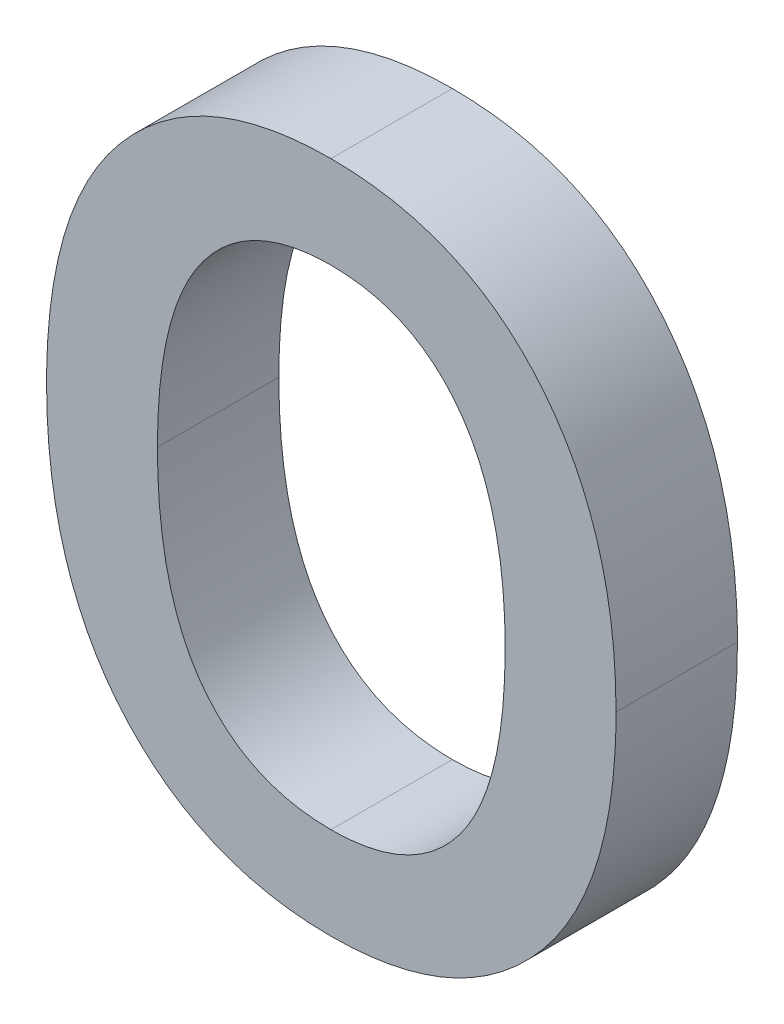
ISO-10303-21;
HEADER;
FILE_DESCRIPTION(('STEP AP214'),'2;1');
FILE_NAME('part.step','',(''),(''),'','','');
FILE_SCHEMA(('AUTOMOTIVE_DESIGN { 1 0 10303 214 1 1 1 1 }'));
ENDSEC;
DATA;
#1=APPLICATION_CONTEXT('core data for automotive mechanical design processes');
#2=APPLICATION_PROTOCOL_DEFINITION('international standard','automotive_design',2000,#1);
#3=PRODUCT_CONTEXT('',#1,'mechanical');
#4=PRODUCT('Part','Part','',(#3));
#5=PRODUCT_RELATED_PRODUCT_CATEGORY('part','',(#4));
#6=PRODUCT_DEFINITION_FORMATION('','',#4);
#7=PRODUCT_DEFINITION_CONTEXT('part definition',#1,'design');
#8=PRODUCT_DEFINITION('design','',#6,#7);
#9=PRODUCT_DEFINITION_SHAPE('','',#8);
#10=(LENGTH_UNIT() NAMED_UNIT(*) SI_UNIT(.MILLI.,.METRE.));
#11=(NAMED_UNIT(*) PLANE_ANGLE_UNIT() SI_UNIT($,.RADIAN.));
#12=(NAMED_UNIT(*) SI_UNIT($,.STERADIAN.) SOLID_ANGLE_UNIT());
#13=UNCERTAINTY_MEASURE_WITH_UNIT(LENGTH_MEASURE(1.E-05),#10,'distance_accuracy_value','');
#14=(GEOMETRIC_REPRESENTATION_CONTEXT(3) GLOBAL_UNCERTAINTY_ASSIGNED_CONTEXT((#13)) GLOBAL_UNIT_ASSIGNED_CONTEXT((#10,
#11,#12)) REPRESENTATION_CONTEXT('',''));
#15=CARTESIAN_POINT('',(0.,0.,0.));
#16=DIRECTION('',(0.,0.,1.));
#17=DIRECTION('',(1.,0.,0.));
#18=AXIS2_PLACEMENT_3D('',#15,#16,#17);
#19=CARTESIAN_POINT('',(0.445025567539005,1.223113950153,0.));
#20=CARTESIAN_POINT('',(0.445025567539005,1.223113950153,0.1));
#21=CARTESIAN_POINT('',(0.376969810098342,1.223113950153,0.));
#22=CARTESIAN_POINT('',(0.376969810098342,1.223113950153,0.1));
#23=CARTESIAN_POINT('',(0.302108476913613,1.122731707928,0.));
#24=CARTESIAN_POINT('',(0.302108476913613,1.122731707928,0.1));
#25=CARTESIAN_POINT('',(0.302108476913613,1.021782334391,0.));
#26=CARTESIAN_POINT('',(0.302108476913613,1.021782334391,0.1));
#27=B_SPLINE_SURFACE_WITH_KNOTS('',2,1,((#19,#20),(#21,#22),(#23,#24),(#25,#26)),.UNSPECIFIED.,
.F.,.F.,.F.,(3,1,3),(2,2),(0.,1.,2.),(0.,0.01),.UNSPECIFIED.);
#28=CARTESIAN_POINT('',(0.445025567539005,1.223113950153,0.));
#29=CARTESIAN_POINT('',(0.376969810098342,1.223113950153,0.));
#30=CARTESIAN_POINT('',(0.302108476913613,1.122731707928,0.));
#31=CARTESIAN_POINT('',(0.302108476913613,1.021782334391,0.));
#32=B_SPLINE_CURVE_WITH_KNOTS('',2,(#28,#29,#30,#31),.UNSPECIFIED.,.F.,.F.,(3,1,3),(0.,1.,2.),.UNSPECIFIED.);
#33=CARTESIAN_POINT('',(0.445025567539005,1.223113950153,0.));
#34=VERTEX_POINT('',#33);
#35=CARTESIAN_POINT('',(0.302108476913613,1.021782334391,0.));
#36=VERTEX_POINT('',#35);
#37=EDGE_CURVE('E11',#34,#36,#32,.T.);
#38=DIRECTION('',(0.,0.,1.));
#39=VECTOR('',#38,1.);
#40=CARTESIAN_POINT('',(0.445025567539005,1.223113950153,0.));
#41=LINE('',#40,#39);
#42=CARTESIAN_POINT('',(0.445025567539005,1.223113950153,0.1));
#43=VERTEX_POINT('',#42);
#44=EDGE_CURVE('E28',#34,#43,#41,.T.);
#45=CARTESIAN_POINT('',(0.302108476913613,1.021782334391,0.1));
#46=CARTESIAN_POINT('',(0.302108476913613,1.122731707928,0.1));
#47=CARTESIAN_POINT('',(0.376969810098342,1.223113950153,0.1));
#48=CARTESIAN_POINT('',(0.445025567539005,1.223113950153,0.1));
#49=B_SPLINE_CURVE_WITH_KNOTS('',2,(#45,#46,#47,#48),.UNSPECIFIED.,.F.,.F.,(3,1,3),(-2.,-1.,0.),.UNSPECIFIED.);
#50=CARTESIAN_POINT('',(0.302108476913613,1.021782334391,0.1));
#51=VERTEX_POINT('',#50);
#52=EDGE_CURVE('E221',#51,#43,#49,.T.);
#53=DIRECTION('',(0.,0.,1.));
#54=VECTOR('',#53,1.);
#55=CARTESIAN_POINT('',(0.302108476913613,1.021782334391,0.));
#56=LINE('',#55,#54);
#57=EDGE_CURVE('E41',#36,#51,#56,.T.);
#58=ORIENTED_EDGE('',*,*,#37,.F.);
#59=ORIENTED_EDGE('',*,*,#44,.T.);
#60=ORIENTED_EDGE('',*,*,#52,.F.);
#61=ORIENTED_EDGE('',*,*,#57,.F.);
#62=EDGE_LOOP('',(#58,#59,#60,#61));
#63=FACE_BOUND('',#62,.T.);
#64=ADVANCED_FACE('F17',(#63),#27,.F.);
#65=CARTESIAN_POINT('',(0.588509789476403,1.021782334391,0.));
#66=CARTESIAN_POINT('',(0.588509789476403,1.021782334391,0.1));
#67=CARTESIAN_POINT('',(0.588509789476403,1.121030313992,0.));
#68=CARTESIAN_POINT('',(0.588509789476403,1.121030313992,0.1));
#69=CARTESIAN_POINT('',(0.513648456291673,1.223113950153,0.));
#70=CARTESIAN_POINT('',(0.513648456291673,1.223113950153,0.1));
#71=CARTESIAN_POINT('',(0.445025567539005,1.223113950153,0.));
#72=CARTESIAN_POINT('',(0.445025567539005,1.223113950153,0.1));
#73=B_SPLINE_SURFACE_WITH_KNOTS('',2,1,((#65,#66),(#67,#68),(#69,#70),(#71,#72)),.UNSPECIFIED.,
.F.,.F.,.F.,(3,1,3),(2,2),(0.,1.,2.),(0.,0.01),.UNSPECIFIED.);
#74=CARTESIAN_POINT('',(0.588509789476403,1.021782334391,0.));
#75=CARTESIAN_POINT('',(0.588509789476403,1.121030313992,0.));
#76=CARTESIAN_POINT('',(0.513648456291673,1.223113950153,0.));
#77=CARTESIAN_POINT('',(0.445025567539005,1.223113950153,0.));
#78=B_SPLINE_CURVE_WITH_KNOTS('',2,(#74,#75,#76,#77),.UNSPECIFIED.,.F.,.F.,(3,1,3),(0.,1.,2.),.UNSPECIFIED.);
#79=CARTESIAN_POINT('',(0.588509789476403,1.021782334391,0.));
#80=VERTEX_POINT('',#79);
#81=EDGE_CURVE('E212',#80,#34,#78,.T.);
#82=DIRECTION('',(0.,0.,1.));
#83=VECTOR('',#82,1.);
#84=CARTESIAN_POINT('',(0.588509789476403,1.021782334391,0.));
#85=LINE('',#84,#83);
#86=CARTESIAN_POINT('',(0.588509789476403,1.021782334391,0.1));
#87=VERTEX_POINT('',#86);
#88=EDGE_CURVE('E206',#80,#87,#85,.T.);
#89=CARTESIAN_POINT('',(0.445025567539005,1.223113950153,0.1));
#90=CARTESIAN_POINT('',(0.513648456291673,1.223113950153,0.1));
#91=CARTESIAN_POINT('',(0.588509789476403,1.121030313992,0.1));
#92=CARTESIAN_POINT('',(0.588509789476403,1.021782334391,0.1));
#93=B_SPLINE_CURVE_WITH_KNOTS('',2,(#89,#90,#91,#92),.UNSPECIFIED.,.F.,.F.,(3,1,3),(-2.,-1.,0.),.UNSPECIFIED.);
#94=EDGE_CURVE('E199',#43,#87,#93,.T.);
#95=ORIENTED_EDGE('',*,*,#81,.F.);
#96=ORIENTED_EDGE('',*,*,#88,.T.);
#97=ORIENTED_EDGE('',*,*,#94,.F.);
#98=ORIENTED_EDGE('',*,*,#44,.F.);
#99=EDGE_LOOP('',(#95,#96,#97,#98));
#100=FACE_BOUND('',#99,.T.);
#101=ADVANCED_FACE('F227',(#100),#73,.F.);
#102=CARTESIAN_POINT('',(0.445025567539005,0.820450718629524,0.));
#103=CARTESIAN_POINT('',(0.445025567539005,0.820450718629524,0.1));
#104=CARTESIAN_POINT('',(0.513648456291673,0.820450718629524,0.));
#105=CARTESIAN_POINT('',(0.513648456291673,0.820450718629524,0.1));
#106=CARTESIAN_POINT('',(0.588509789476403,0.919698698230491,0.));
#107=CARTESIAN_POINT('',(0.588509789476403,0.919698698230491,0.1));
#108=CARTESIAN_POINT('',(0.588509789476403,1.021782334391,0.));
#109=CARTESIAN_POINT('',(0.588509789476403,1.021782334391,0.1));
#110=B_SPLINE_SURFACE_WITH_KNOTS('',2,1,((#102,#103),(#104,#105),(#106,#107),(#108,#109)),
.UNSPECIFIED.,.F.,.F.,.F.,(3,1,3),(2,2),(0.,1.,2.),(0.,0.01),.UNSPECIFIED.);
#111=CARTESIAN_POINT('',(0.445025567539005,0.820450718629524,0.));
#112=CARTESIAN_POINT('',(0.513648456291673,0.820450718629524,0.));
#113=CARTESIAN_POINT('',(0.588509789476403,0.919698698230491,0.));
#114=CARTESIAN_POINT('',(0.588509789476403,1.021782334391,0.));
#115=B_SPLINE_CURVE_WITH_KNOTS('',2,(#111,#112,#113,#114),.UNSPECIFIED.,.F.,.F.,(3,1,3),(0.,1.,
2.),.UNSPECIFIED.);
#116=CARTESIAN_POINT('',(0.445025567539005,0.820450718629524,0.));
#117=VERTEX_POINT('',#116);
#118=EDGE_CURVE('E194',#117,#80,#115,.T.);
#119=DIRECTION('',(0.,0.,1.));
#120=VECTOR('',#119,1.);
#121=CARTESIAN_POINT('',(0.445025567539005,0.820450718629524,0.));
#122=LINE('',#121,#120);
#123=CARTESIAN_POINT('',(0.445025567539005,0.820450718629524,0.1));
#124=VERTEX_POINT('',#123);
#125=EDGE_CURVE('E188',#117,#124,#122,.T.);
#126=CARTESIAN_POINT('',(0.588509789476403,1.021782334391,0.1));
#127=CARTESIAN_POINT('',(0.588509789476403,0.919698698230491,0.1));
#128=CARTESIAN_POINT('',(0.513648456291673,0.820450718629524,0.1));
#129=CARTESIAN_POINT('',(0.445025567539005,0.820450718629524,0.1));
#130=B_SPLINE_CURVE_WITH_KNOTS('',2,(#126,#127,#128,#129),.UNSPECIFIED.,.F.,.F.,(3,1,3),(-2.,
-1.,0.),.UNSPECIFIED.);
#131=EDGE_CURVE('E181',#87,#124,#130,.T.);
#132=ORIENTED_EDGE('',*,*,#118,.F.);
#133=ORIENTED_EDGE('',*,*,#125,.T.);
#134=ORIENTED_EDGE('',*,*,#131,.F.);
#135=ORIENTED_EDGE('',*,*,#88,.F.);
#136=EDGE_LOOP('',(#132,#133,#134,#135));
#137=FACE_BOUND('',#136,.T.);
#138=ADVANCED_FACE('F237',(#137),#110,.F.);
#139=CARTESIAN_POINT('',(0.302108476913613,1.021782334391,0.));
#140=CARTESIAN_POINT('',(0.302108476913613,1.021782334391,0.1));
#141=CARTESIAN_POINT('',(0.302108476913613,0.919698698230491,0.));
#142=CARTESIAN_POINT('',(0.302108476913613,0.919698698230491,0.1));
#143=CARTESIAN_POINT('',(0.376402678786337,0.820450718629524,0.));
#144=CARTESIAN_POINT('',(0.376402678786337,0.820450718629524,0.1));
#145=CARTESIAN_POINT('',(0.445025567539005,0.820450718629524,0.));
#146=CARTESIAN_POINT('',(0.445025567539005,0.820450718629524,0.1));
#147=B_SPLINE_SURFACE_WITH_KNOTS('',2,1,((#139,#140),(#141,#142),(#143,#144),(#145,#146)),
.UNSPECIFIED.,.F.,.F.,.F.,(3,1,3),(2,2),(0.,1.,2.),(0.,0.01),.UNSPECIFIED.);
#148=CARTESIAN_POINT('',(0.302108476913613,1.021782334391,0.));
#149=CARTESIAN_POINT('',(0.302108476913613,0.919698698230491,0.));
#150=CARTESIAN_POINT('',(0.376402678786337,0.820450718629524,0.));
#151=CARTESIAN_POINT('',(0.445025567539005,0.820450718629524,0.));
#152=B_SPLINE_CURVE_WITH_KNOTS('',2,(#148,#149,#150,#151),.UNSPECIFIED.,.F.,.F.,(3,1,3),(0.,1.,
2.),.UNSPECIFIED.);
#153=EDGE_CURVE('E173',#36,#117,#152,.T.);
#154=CARTESIAN_POINT('',(0.445025567539005,0.820450718629524,0.1));
#155=CARTESIAN_POINT('',(0.376402678786337,0.820450718629524,0.1));
#156=CARTESIAN_POINT('',(0.302108476913613,0.919698698230491,0.1));
#157=CARTESIAN_POINT('',(0.302108476913613,1.021782334391,0.1));
#158=B_SPLINE_CURVE_WITH_KNOTS('',2,(#154,#155,#156,#157),.UNSPECIFIED.,.F.,.F.,(3,1,3),(-2.,
-1.,0.),.UNSPECIFIED.);
#159=EDGE_CURVE('E165',#124,#51,#158,.T.);
#160=ORIENTED_EDGE('',*,*,#153,.F.);
#161=ORIENTED_EDGE('',*,*,#57,.T.);
#162=ORIENTED_EDGE('',*,*,#159,.F.);
#163=ORIENTED_EDGE('',*,*,#125,.F.);
#164=EDGE_LOOP('',(#160,#161,#162,#163));
#165=FACE_BOUND('',#164,.T.);
#166=ADVANCED_FACE('F232',(#165),#147,.F.);
#167=CARTESIAN_POINT('',(0.679817930709292,1.021782334391,0.));
#168=CARTESIAN_POINT('',(0.679817930709292,1.021782334391,0.1));
#169=CARTESIAN_POINT('',(0.679817930709292,1.149954010905,0.));
#170=CARTESIAN_POINT('',(0.679817930709292,1.149954010905,0.1));
#171=CARTESIAN_POINT('',(0.554481910756071,1.299109545962,0.));
#172=CARTESIAN_POINT('',(0.554481910756071,1.299109545962,0.1));
#173=CARTESIAN_POINT('',(0.445025567539005,1.299109545962,0.));
#174=CARTESIAN_POINT('',(0.445025567539005,1.299109545962,0.1));
#175=B_SPLINE_SURFACE_WITH_KNOTS('',2,1,((#167,#168),(#169,#170),(#171,#172),(#173,#174)),
.UNSPECIFIED.,.F.,.F.,.F.,(3,1,3),(2,2),(-2.,-1.,0.),(0.,0.01),.UNSPECIFIED.);
#176=CARTESIAN_POINT('',(0.445025567539005,1.299109545962,0.));
#177=CARTESIAN_POINT('',(0.554481910756071,1.299109545962,0.));
#178=CARTESIAN_POINT('',(0.679817930709292,1.149954010905,0.));
#179=CARTESIAN_POINT('',(0.679817930709292,1.021782334391,0.));
#180=B_SPLINE_CURVE_WITH_KNOTS('',2,(#176,#177,#178,#179),.UNSPECIFIED.,.F.,.F.,(3,1,3),(0.,1.,
2.),.UNSPECIFIED.);
#181=CARTESIAN_POINT('',(0.445025567539005,1.299109545962,0.));
#182=VERTEX_POINT('',#181);
#183=CARTESIAN_POINT('',(0.679817930709292,1.021782334391,0.));
#184=VERTEX_POINT('',#183);
#185=EDGE_CURVE('E161',#182,#184,#180,.T.);
#186=DIRECTION('',(0.,0.,1.));
#187=VECTOR('',#186,1.);
#188=CARTESIAN_POINT('',(0.445025567539005,1.299109545962,0.));
#189=LINE('',#188,#187);
#190=CARTESIAN_POINT('',(0.445025567539005,1.299109545962,0.1));
#191=VERTEX_POINT('',#190);
#192=EDGE_CURVE('E156',#182,#191,#189,.T.);
#193=CARTESIAN_POINT('',(0.679817930709292,1.021782334391,0.1));
#194=CARTESIAN_POINT('',(0.679817930709292,1.149954010905,0.1));
#195=CARTESIAN_POINT('',(0.554481910756071,1.299109545962,0.1));
#196=CARTESIAN_POINT('',(0.445025567539005,1.299109545962,0.1));
#197=B_SPLINE_CURVE_WITH_KNOTS('',2,(#193,#194,#195,#196),.UNSPECIFIED.,.F.,.F.,(3,1,3),(-2.,
-1.,0.),.UNSPECIFIED.);
#198=CARTESIAN_POINT('',(0.679817930709292,1.021782334391,0.1));
#199=VERTEX_POINT('',#198);
#200=EDGE_CURVE('E110',#199,#191,#197,.T.);
#201=DIRECTION('',(0.,0.,1.));
#202=VECTOR('',#201,1.);
#203=CARTESIAN_POINT('',(0.679817930709292,1.021782334391,0.));
#204=LINE('',#203,#202);
#205=EDGE_CURVE('E147',#184,#199,#204,.T.);
#206=ORIENTED_EDGE('',*,*,#185,.F.);
#207=ORIENTED_EDGE('',*,*,#192,.T.);
#208=ORIENTED_EDGE('',*,*,#200,.F.);
#209=ORIENTED_EDGE('',*,*,#205,.F.);
#210=EDGE_LOOP('',(#206,#207,#208,#209));
#211=FACE_BOUND('',#210,.T.);
#212=ADVANCED_FACE('F245',(#211),#175,.T.);
#213=CARTESIAN_POINT('',(0.445025567539005,0.744455122820784,0.));
#214=CARTESIAN_POINT('',(0.445025567539005,0.744455122820784,0.1));
#215=CARTESIAN_POINT('',(0.550511991572032,0.744455122820784,0.));
#216=CARTESIAN_POINT('',(0.550511991572032,0.744455122820784,0.1));
#217=CARTESIAN_POINT('',(0.679817930709292,0.890207870006203,0.));
#218=CARTESIAN_POINT('',(0.679817930709292,0.890207870006203,0.1));
#219=CARTESIAN_POINT('',(0.679817930709292,1.021782334391,0.));
#220=CARTESIAN_POINT('',(0.679817930709292,1.021782334391,0.1));
#221=B_SPLINE_SURFACE_WITH_KNOTS('',2,1,((#213,#214),(#215,#216),(#217,#218),(#219,#220)),
.UNSPECIFIED.,.F.,.F.,.F.,(3,1,3),(2,2),(-2.,-1.,0.),(0.,0.01),.UNSPECIFIED.);
#222=CARTESIAN_POINT('',(0.679817930709292,1.021782334391,0.));
#223=CARTESIAN_POINT('',(0.679817930709292,0.890207870006203,0.));
#224=CARTESIAN_POINT('',(0.550511991572032,0.744455122820784,0.));
#225=CARTESIAN_POINT('',(0.445025567539005,0.744455122820784,0.));
#226=B_SPLINE_CURVE_WITH_KNOTS('',2,(#222,#223,#224,#225),.UNSPECIFIED.,.F.,.F.,(3,1,3),(0.,1.,
2.),.UNSPECIFIED.);
#227=CARTESIAN_POINT('',(0.445025567539005,0.744455122820784,0.));
#228=VERTEX_POINT('',#227);
#229=EDGE_CURVE('E140',#184,#228,#226,.T.);
#230=CARTESIAN_POINT('',(0.445025567539005,0.744455122820784,0.1));
#231=CARTESIAN_POINT('',(0.550511991572032,0.744455122820784,0.1));
#232=CARTESIAN_POINT('',(0.679817930709292,0.890207870006203,0.1));
#233=CARTESIAN_POINT('',(0.679817930709292,1.021782334391,0.1));
#234=B_SPLINE_CURVE_WITH_KNOTS('',2,(#230,#231,#232,#233),.UNSPECIFIED.,.F.,.F.,(3,1,3),(-2.,
-1.,0.),.UNSPECIFIED.);
#235=CARTESIAN_POINT('',(0.445025567539005,0.744455122820784,0.1));
#236=VERTEX_POINT('',#235);
#237=EDGE_CURVE('E136',#236,#199,#234,.T.);
#238=DIRECTION('',(0.,0.,1.));
#239=VECTOR('',#238,1.);
#240=CARTESIAN_POINT('',(0.445025567539005,0.744455122820784,0.));
#241=LINE('',#240,#239);
#242=EDGE_CURVE('E93',#228,#236,#241,.T.);
#243=ORIENTED_EDGE('',*,*,#229,.F.);
#244=ORIENTED_EDGE('',*,*,#205,.T.);
#245=ORIENTED_EDGE('',*,*,#237,.F.);
#246=ORIENTED_EDGE('',*,*,#242,.F.);
#247=EDGE_LOOP('',(#243,#244,#245,#246));
#248=FACE_BOUND('',#247,.T.);
#249=ADVANCED_FACE('F283',(#248),#221,.T.);
#250=CARTESIAN_POINT('',(0.210800335680724,1.021782334391,0.));
#251=CARTESIAN_POINT('',(0.210800335680724,1.021782334391,0.1));
#252=CARTESIAN_POINT('',(0.210800335680724,0.889640738694198,0.));
#253=CARTESIAN_POINT('',(0.210800335680724,0.889640738694198,0.1));
#254=CARTESIAN_POINT('',(0.338404880881967,0.744455122820784,0.));
#255=CARTESIAN_POINT('',(0.338404880881967,0.744455122820784,0.1));
#256=CARTESIAN_POINT('',(0.445025567539005,0.744455122820784,0.));
#257=CARTESIAN_POINT('',(0.445025567539005,0.744455122820784,0.1));
#258=B_SPLINE_SURFACE_WITH_KNOTS('',2,1,((#250,#251),(#252,#253),(#254,#255),(#256,#257)),
.UNSPECIFIED.,.F.,.F.,.F.,(3,1,3),(2,2),(-2.,-1.,0.),(0.,0.01),.UNSPECIFIED.);
#259=CARTESIAN_POINT('',(0.445025567539005,0.744455122820784,0.));
#260=CARTESIAN_POINT('',(0.338404880881967,0.744455122820784,0.));
#261=CARTESIAN_POINT('',(0.210800335680724,0.889640738694198,0.));
#262=CARTESIAN_POINT('',(0.210800335680724,1.021782334391,0.));
#263=B_SPLINE_CURVE_WITH_KNOTS('',2,(#259,#260,#261,#262),.UNSPECIFIED.,.F.,.F.,(3,1,3),(0.,1.,
2.),.UNSPECIFIED.);
#264=CARTESIAN_POINT('',(0.210800335680724,1.021782334391,0.));
#265=VERTEX_POINT('',#264);
#266=EDGE_CURVE('E97',#228,#265,#263,.T.);
#267=CARTESIAN_POINT('',(0.210800335680724,1.021782334391,0.1));
#268=CARTESIAN_POINT('',(0.210800335680724,0.889640738694198,0.1));
#269=CARTESIAN_POINT('',(0.338404880881967,0.744455122820784,0.1));
#270=CARTESIAN_POINT('',(0.445025567539005,0.744455122820784,0.1));
#271=B_SPLINE_CURVE_WITH_KNOTS('',2,(#267,#268,#269,#270),.UNSPECIFIED.,.F.,.F.,(3,1,3),(-2.,
-1.,0.),.UNSPECIFIED.);
#272=CARTESIAN_POINT('',(0.210800335680724,1.021782334391,0.1));
#273=VERTEX_POINT('',#272);
#274=EDGE_CURVE('E86',#273,#236,#271,.T.);
#275=DIRECTION('',(0.,0.,1.));
#276=VECTOR('',#275,1.);
#277=CARTESIAN_POINT('',(0.210800335680724,1.021782334391,0.));
#278=LINE('',#277,#276);
#279=EDGE_CURVE('E90',#265,#273,#278,.T.);
#280=ORIENTED_EDGE('',*,*,#266,.F.);
#281=ORIENTED_EDGE('',*,*,#242,.T.);
#282=ORIENTED_EDGE('',*,*,#274,.F.);
#283=ORIENTED_EDGE('',*,*,#279,.F.);
#284=EDGE_LOOP('',(#280,#281,#282,#283));
#285=FACE_BOUND('',#284,.T.);
#286=ADVANCED_FACE('F89',(#285),#258,.T.);
#287=CARTESIAN_POINT('',(0.445025567539005,1.299109545962,0.));
#288=CARTESIAN_POINT('',(0.445025567539005,1.299109545962,0.1));
#289=CARTESIAN_POINT('',(0.338404880881967,1.299109545962,0.));
#290=CARTESIAN_POINT('',(0.338404880881967,1.299109545962,0.1));
#291=CARTESIAN_POINT('',(0.210800335680724,1.154491061401,0.));
#292=CARTESIAN_POINT('',(0.210800335680724,1.154491061401,0.1));
#293=CARTESIAN_POINT('',(0.210800335680724,1.021782334391,0.));
#294=CARTESIAN_POINT('',(0.210800335680724,1.021782334391,0.1));
#295=B_SPLINE_SURFACE_WITH_KNOTS('',2,1,((#287,#288),(#289,#290),(#291,#292),(#293,#294)),
.UNSPECIFIED.,.F.,.F.,.F.,(3,1,3),(2,2),(-2.,-1.,0.),(0.,0.01),.UNSPECIFIED.);
#296=CARTESIAN_POINT('',(0.210800335680724,1.021782334391,0.));
#297=CARTESIAN_POINT('',(0.210800335680724,1.154491061401,0.));
#298=CARTESIAN_POINT('',(0.338404880881967,1.299109545962,0.));
#299=CARTESIAN_POINT('',(0.445025567539005,1.299109545962,0.));
#300=B_SPLINE_CURVE_WITH_KNOTS('',2,(#296,#297,#298,#299),.UNSPECIFIED.,.F.,.F.,(3,1,3),(0.,1.,
2.),.UNSPECIFIED.);
#301=EDGE_CURVE('E105',#265,#182,#300,.T.);
#302=CARTESIAN_POINT('',(0.445025567539005,1.299109545962,0.1));
#303=CARTESIAN_POINT('',(0.338404880881967,1.299109545962,0.1));
#304=CARTESIAN_POINT('',(0.210800335680724,1.154491061401,0.1));
#305=CARTESIAN_POINT('',(0.210800335680724,1.021782334391,0.1));
#306=B_SPLINE_CURVE_WITH_KNOTS('',2,(#302,#303,#304,#305),.UNSPECIFIED.,.F.,.F.,(3,1,3),(-2.,
-1.,0.),.UNSPECIFIED.);
#307=EDGE_CURVE('E103',#191,#273,#306,.T.);
#308=ORIENTED_EDGE('',*,*,#301,.F.);
#309=ORIENTED_EDGE('',*,*,#279,.T.);
#310=ORIENTED_EDGE('',*,*,#307,.F.);
#311=ORIENTED_EDGE('',*,*,#192,.F.);
#312=EDGE_LOOP('',(#308,#309,#310,#311));
#313=FACE_BOUND('',#312,.T.);
#314=ADVANCED_FACE('F101',(#313),#295,.T.);
#315=CARTESIAN_POINT('',(0.445054933393869,1.02191591851,0.));
#316=DIRECTION('',(0.,0.,1.));
#317=DIRECTION('',(1.,0.,0.));
#318=AXIS2_PLACEMENT_3D('',#315,#316,#317);
#319=PLANE('',#318);
#320=ORIENTED_EDGE('',*,*,#301,.T.);
#321=ORIENTED_EDGE('',*,*,#185,.T.);
#322=ORIENTED_EDGE('',*,*,#229,.T.);
#323=ORIENTED_EDGE('',*,*,#266,.T.);
#324=EDGE_LOOP('',(#320,#321,#322,#323));
#325=FACE_BOUND('',#324,.T.);
#326=ORIENTED_EDGE('',*,*,#37,.T.);
#327=ORIENTED_EDGE('',*,*,#153,.T.);
#328=ORIENTED_EDGE('',*,*,#118,.T.);
#329=ORIENTED_EDGE('',*,*,#81,.T.);
#330=EDGE_LOOP('',(#326,#327,#328,#329));
#331=FACE_BOUND('',#330,.T.);
#332=ADVANCED_FACE('F235',(#325,#331),#319,.F.);
#333=CARTESIAN_POINT('',(0.445054933393869,1.02191591851,0.1));
#334=DIRECTION('',(0.,0.,1.));
#335=DIRECTION('',(1.,0.,0.));
#336=AXIS2_PLACEMENT_3D('',#333,#334,#335);
#337=PLANE('',#336);
#338=ORIENTED_EDGE('',*,*,#307,.T.);
#339=ORIENTED_EDGE('',*,*,#274,.T.);
#340=ORIENTED_EDGE('',*,*,#237,.T.);
#341=ORIENTED_EDGE('',*,*,#200,.T.);
#342=EDGE_LOOP('',(#338,#339,#340,#341));
#343=FACE_BOUND('',#342,.T.);
#344=ORIENTED_EDGE('',*,*,#52,.T.);
#345=ORIENTED_EDGE('',*,*,#94,.T.);
#346=ORIENTED_EDGE('',*,*,#131,.T.);
#347=ORIENTED_EDGE('',*,*,#159,.T.);
#348=EDGE_LOOP('',(#344,#345,#346,#347));
#349=FACE_BOUND('',#348,.T.);
#350=ADVANCED_FACE('F108',(#343,#349),#337,.T.);
#351=CLOSED_SHELL('',(#64,#101,#138,#166,#212,#249,#286,#314,#332,#350));
#352=MANIFOLD_SOLID_BREP('B1',#351);
#353=ADVANCED_BREP_SHAPE_REPRESENTATION('',(#18,#352),#14);
#354=SHAPE_DEFINITION_REPRESENTATION(#9,#353);
ENDSEC;
END-ISO-10303-21;
